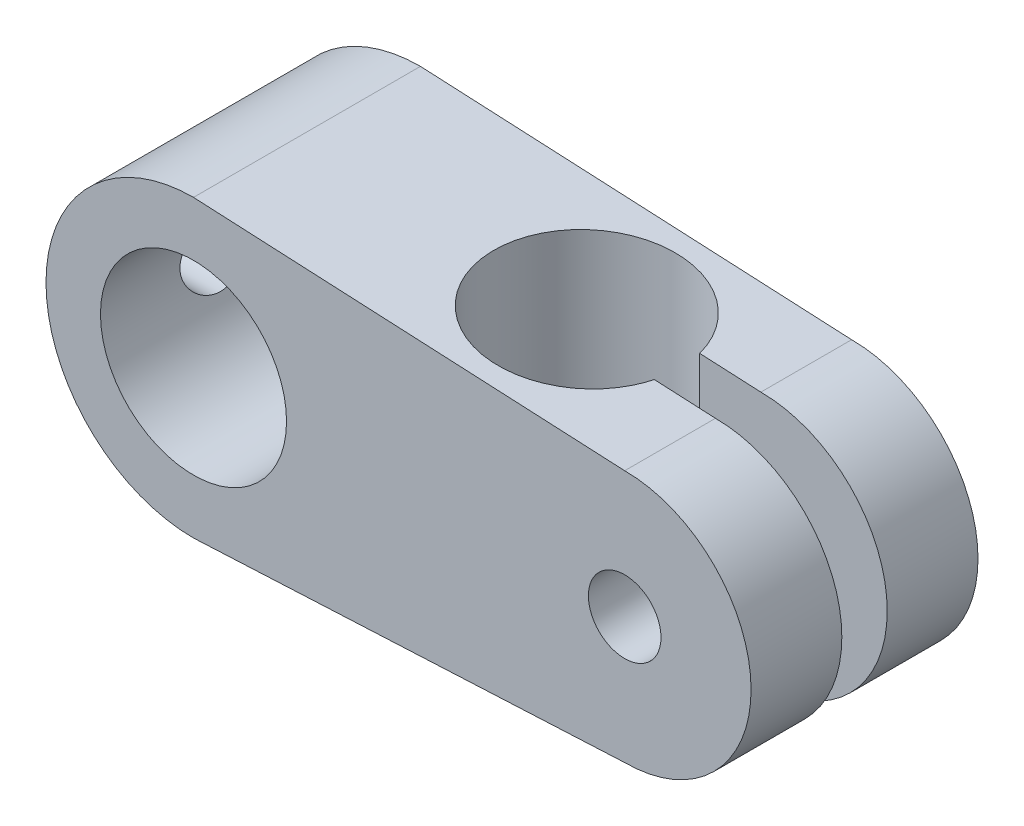
ISO-10303-21;
HEADER;
FILE_DESCRIPTION(('STEP AP214'),'2;1');
FILE_NAME('part.step','',(''),(''),'','','');
FILE_SCHEMA(('AUTOMOTIVE_DESIGN { 1 0 10303 214 1 1 1 1 }'));
ENDSEC;
DATA;
#1=APPLICATION_CONTEXT('core data for automotive mechanical design processes');
#2=APPLICATION_PROTOCOL_DEFINITION('international standard','automotive_design',2000,#1);
#3=PRODUCT_CONTEXT('',#1,'mechanical');
#4=PRODUCT('Part','Part','',(#3));
#5=PRODUCT_RELATED_PRODUCT_CATEGORY('part','',(#4));
#6=PRODUCT_DEFINITION_FORMATION('','',#4);
#7=PRODUCT_DEFINITION_CONTEXT('part definition',#1,'design');
#8=PRODUCT_DEFINITION('design','',#6,#7);
#9=PRODUCT_DEFINITION_SHAPE('','',#8);
#10=(LENGTH_UNIT() NAMED_UNIT(*) SI_UNIT(.MILLI.,.METRE.));
#11=(NAMED_UNIT(*) PLANE_ANGLE_UNIT() SI_UNIT($,.RADIAN.));
#12=(NAMED_UNIT(*) SI_UNIT($,.STERADIAN.) SOLID_ANGLE_UNIT());
#13=UNCERTAINTY_MEASURE_WITH_UNIT(LENGTH_MEASURE(1.E-05),#10,'distance_accuracy_value','');
#14=(GEOMETRIC_REPRESENTATION_CONTEXT(3) GLOBAL_UNCERTAINTY_ASSIGNED_CONTEXT((#13)) GLOBAL_UNIT_ASSIGNED_CONTEXT((#10,
#11,#12)) REPRESENTATION_CONTEXT('',''));
#15=CARTESIAN_POINT('',(0.,0.,0.));
#16=DIRECTION('',(0.,0.,1.));
#17=DIRECTION('',(1.,0.,0.));
#18=AXIS2_PLACEMENT_3D('',#15,#16,#17);
#19=CARTESIAN_POINT('',(0.317790422584702,-6.48442564411573,10.));
#20=DIRECTION('',(-0.0489495122695475,0.998801254128454,0.));
#21=DIRECTION('',(-0.998801254128454,-0.0489495122695475,0.));
#22=AXIS2_PLACEMENT_3D('',#19,#20,#21);
#23=PLANE('',#22);
#24=DIRECTION('',(0.998801254128454,0.0489495122695475,0.));
#25=VECTOR('',#24,1.);
#26=CARTESIAN_POINT('',(0.317790422584702,-6.48442564411573,4.));
#27=LINE('',#26,#25);
#28=CARTESIAN_POINT('',(16.3061190339678,-5.70086546705592,4.));
#29=VERTEX_POINT('',#28);
#30=CARTESIAN_POINT('',(19.,-5.56884304632462,4.));
#31=VERTEX_POINT('',#30);
#32=EDGE_CURVE('E133',#29,#31,#27,.T.);
#33=ORIENTED_EDGE('',*,*,#32,.F.);
#34=CARTESIAN_POINT('',(12.3299399635536,-5.89573108760722,5.));
#35=DIRECTION('',(-0.0489495122695475,0.998801254128454,0.));
#36=DIRECTION('',(0.998801254128454,0.0489495122695475,0.));
#37=AXIS2_PLACEMENT_3D('',#34,#35,#36);
#38=ELLIPSE('',#37,4.10492075681025,4.1);
#39=CARTESIAN_POINT('',(16.3061190339678,-5.70086546705592,6.));
#40=VERTEX_POINT('',#39);
#41=EDGE_CURVE('E132',#29,#40,#38,.T.);
#42=ORIENTED_EDGE('',*,*,#41,.T.);
#43=DIRECTION('',(0.998801254128454,0.0489495122695475,0.));
#44=VECTOR('',#43,1.);
#45=CARTESIAN_POINT('',(0.317790422584702,-6.48442564411573,6.));
#46=LINE('',#45,#44);
#47=CARTESIAN_POINT('',(19.,-5.56884304632462,6.));
#48=VERTEX_POINT('',#47);
#49=EDGE_CURVE('E64',#40,#48,#46,.T.);
#50=ORIENTED_EDGE('',*,*,#49,.T.);
#51=DIRECTION('',(0.,0.,-1.));
#52=VECTOR('',#51,1.);
#53=CARTESIAN_POINT('',(19.,-5.56884304632462,10.));
#54=LINE('',#53,#52);
#55=CARTESIAN_POINT('',(19.,-5.56884304632462,10.));
#56=VERTEX_POINT('',#55);
#57=EDGE_CURVE('E118',#56,#48,#54,.T.);
#58=ORIENTED_EDGE('',*,*,#57,.F.);
#59=DIRECTION('',(0.998801254128455,0.0489495122695475,0.));
#60=VECTOR('',#59,1.);
#61=CARTESIAN_POINT('',(0.317790422584702,-6.48442564411573,10.));
#62=LINE('',#61,#60);
#63=CARTESIAN_POINT('',(0.,-6.5,10.));
#64=VERTEX_POINT('',#63);
#65=EDGE_CURVE('E217',#64,#56,#62,.T.);
#66=ORIENTED_EDGE('',*,*,#65,.F.);
#67=DIRECTION('',(0.,0.,-1.));
#68=VECTOR('',#67,1.);
#69=CARTESIAN_POINT('',(0.,-6.5,10.));
#70=LINE('',#69,#68);
#71=CARTESIAN_POINT('',(0.,-6.5,0.));
#72=VERTEX_POINT('',#71);
#73=EDGE_CURVE('E227',#64,#72,#70,.T.);
#74=ORIENTED_EDGE('',*,*,#73,.T.);
#75=DIRECTION('',(0.998801254128455,0.0489495122695475,0.));
#76=VECTOR('',#75,1.);
#77=CARTESIAN_POINT('',(0.317790422584702,-6.48442564411573,0.));
#78=LINE('',#77,#76);
#79=CARTESIAN_POINT('',(19.,-5.56884304632462,0.));
#80=VERTEX_POINT('',#79);
#81=EDGE_CURVE('E230',#72,#80,#78,.T.);
#82=ORIENTED_EDGE('',*,*,#81,.T.);
#83=EDGE_CURVE('E204',#31,#80,#54,.T.);
#84=ORIENTED_EDGE('',*,*,#83,.F.);
#85=EDGE_LOOP('',(#33,#42,#50,#58,#66,#74,#82,#84));
#86=FACE_BOUND('',#85,.T.);
#87=ADVANCED_FACE('F41',(#86),#23,.F.);
#88=CARTESIAN_POINT('',(19.,0.,10.));
#89=DIRECTION('',(0.,0.,-1.));
#90=DIRECTION('',(-1.,0.,0.));
#91=AXIS2_PLACEMENT_3D('',#88,#89,#90);
#92=CYLINDRICAL_SURFACE('',#91,5.56884304632462);
#93=CARTESIAN_POINT('',(19.,0.,4.));
#94=DIRECTION('',(0.,0.,1.));
#95=DIRECTION('',(1.,0.,0.));
#96=AXIS2_PLACEMENT_3D('',#93,#94,#95);
#97=CIRCLE('',#96,5.56884304632462);
#98=CARTESIAN_POINT('',(19.,5.56884304632462,4.));
#99=VERTEX_POINT('',#98);
#100=EDGE_CURVE('E137',#31,#99,#97,.T.);
#101=ORIENTED_EDGE('',*,*,#100,.F.);
#102=ORIENTED_EDGE('',*,*,#83,.T.);
#103=CARTESIAN_POINT('',(19.,0.,0.));
#104=DIRECTION('',(0.,0.,1.));
#105=DIRECTION('',(1.,0.,0.));
#106=AXIS2_PLACEMENT_3D('',#103,#104,#105);
#107=CIRCLE('',#106,5.56884304632462);
#108=CARTESIAN_POINT('',(19.,5.56884304632462,0.));
#109=VERTEX_POINT('',#108);
#110=EDGE_CURVE('E232',#80,#109,#107,.T.);
#111=ORIENTED_EDGE('',*,*,#110,.T.);
#112=DIRECTION('',(0.,0.,-1.));
#113=VECTOR('',#112,1.);
#114=CARTESIAN_POINT('',(19.,5.56884304632462,10.));
#115=LINE('',#114,#113);
#116=EDGE_CURVE('E209',#99,#109,#115,.T.);
#117=ORIENTED_EDGE('',*,*,#116,.F.);
#118=EDGE_LOOP('',(#101,#102,#111,#117));
#119=FACE_BOUND('',#118,.T.);
#120=ADVANCED_FACE('F192',(#119),#92,.T.);
#121=CARTESIAN_POINT('',(0.317790422584702,6.48442564411573,10.));
#122=DIRECTION('',(0.0489495122695475,0.998801254128454,0.));
#123=DIRECTION('',(-0.998801254128454,0.0489495122695475,0.));
#124=AXIS2_PLACEMENT_3D('',#121,#122,#123);
#125=PLANE('',#124);
#126=CARTESIAN_POINT('',(12.3299399635536,5.89573108760721,5.));
#127=DIRECTION('',(0.0489495122695475,0.998801254128454,0.));
#128=DIRECTION('',(-0.998801254128454,0.0489495122695475,0.));
#129=AXIS2_PLACEMENT_3D('',#126,#127,#128);
#130=ELLIPSE('',#129,4.10492075681025,4.1);
#131=CARTESIAN_POINT('',(16.3061190339678,5.70086546705591,4.));
#132=VERTEX_POINT('',#131);
#133=CARTESIAN_POINT('',(16.3061190339678,5.70086546705591,6.));
#134=VERTEX_POINT('',#133);
#135=EDGE_CURVE('E124',#132,#134,#130,.T.);
#136=ORIENTED_EDGE('',*,*,#135,.F.);
#137=DIRECTION('',(0.998801254128454,-0.0489495122695475,0.));
#138=VECTOR('',#137,1.);
#139=CARTESIAN_POINT('',(0.317790422584702,6.48442564411573,4.));
#140=LINE('',#139,#138);
#141=EDGE_CURVE('E71',#132,#99,#140,.T.);
#142=ORIENTED_EDGE('',*,*,#141,.T.);
#143=ORIENTED_EDGE('',*,*,#116,.T.);
#144=DIRECTION('',(0.998801254128455,-0.0489495122695475,0.));
#145=VECTOR('',#144,1.);
#146=CARTESIAN_POINT('',(0.317790422584702,6.48442564411573,0.));
#147=LINE('',#146,#145);
#148=CARTESIAN_POINT('',(0.,6.5,0.));
#149=VERTEX_POINT('',#148);
#150=EDGE_CURVE('E234',#149,#109,#147,.T.);
#151=ORIENTED_EDGE('',*,*,#150,.F.);
#152=DIRECTION('',(0.,0.,-1.));
#153=VECTOR('',#152,1.);
#154=CARTESIAN_POINT('',(0.,6.5,10.));
#155=LINE('',#154,#153);
#156=CARTESIAN_POINT('',(0.,6.5,10.));
#157=VERTEX_POINT('',#156);
#158=EDGE_CURVE('E240',#157,#149,#155,.T.);
#159=ORIENTED_EDGE('',*,*,#158,.F.);
#160=DIRECTION('',(0.998801254128455,-0.0489495122695475,0.));
#161=VECTOR('',#160,1.);
#162=CARTESIAN_POINT('',(0.317790422584702,6.48442564411573,10.));
#163=LINE('',#162,#161);
#164=CARTESIAN_POINT('',(19.,5.56884304632462,10.));
#165=VERTEX_POINT('',#164);
#166=EDGE_CURVE('E223',#157,#165,#163,.T.);
#167=ORIENTED_EDGE('',*,*,#166,.T.);
#168=CARTESIAN_POINT('',(19.,5.56884304632462,6.));
#169=VERTEX_POINT('',#168);
#170=EDGE_CURVE('E127',#165,#169,#115,.T.);
#171=ORIENTED_EDGE('',*,*,#170,.T.);
#172=DIRECTION('',(0.998801254128454,-0.0489495122695475,0.));
#173=VECTOR('',#172,1.);
#174=CARTESIAN_POINT('',(0.317790422584702,6.48442564411573,6.));
#175=LINE('',#174,#173);
#176=EDGE_CURVE('E112',#134,#169,#175,.T.);
#177=ORIENTED_EDGE('',*,*,#176,.F.);
#178=EDGE_LOOP('',(#136,#142,#143,#151,#159,#167,#171,#177));
#179=FACE_BOUND('',#178,.T.);
#180=ADVANCED_FACE('F123',(#179),#125,.T.);
#181=CARTESIAN_POINT('',(12.3299399635536,-9.5,5.));
#182=DIRECTION('',(0.,1.,0.));
#183=DIRECTION('',(0.,0.,1.));
#184=AXIS2_PLACEMENT_3D('',#181,#182,#183);
#185=CYLINDRICAL_SURFACE('',#184,4.1);
#186=DIRECTION('',(0.,1.,0.));
#187=VECTOR('',#186,1.);
#188=CARTESIAN_POINT('',(16.3061190339678,-9.5,4.));
#189=LINE('',#188,#187);
#190=EDGE_CURVE('E11',#132,#29,#189,.F.);
#191=ORIENTED_EDGE('',*,*,#190,.F.);
#192=ORIENTED_EDGE('',*,*,#135,.T.);
#193=DIRECTION('',(0.,1.,0.));
#194=VECTOR('',#193,1.);
#195=CARTESIAN_POINT('',(16.3061190339678,-9.5,6.));
#196=LINE('',#195,#194);
#197=EDGE_CURVE('E56',#134,#40,#196,.F.);
#198=ORIENTED_EDGE('',*,*,#197,.T.);
#199=ORIENTED_EDGE('',*,*,#41,.F.);
#200=EDGE_LOOP('',(#191,#192,#198,#199));
#201=FACE_BOUND('',#200,.T.);
#202=ADVANCED_FACE('F131',(#201),#185,.F.);
#203=ORIENTED_EDGE('',*,*,#57,.T.);
#204=CARTESIAN_POINT('',(19.,0.,6.));
#205=DIRECTION('',(0.,0.,1.));
#206=DIRECTION('',(1.,0.,0.));
#207=AXIS2_PLACEMENT_3D('',#204,#205,#206);
#208=CIRCLE('',#207,5.56884304632462);
#209=EDGE_CURVE('E128',#48,#169,#208,.T.);
#210=ORIENTED_EDGE('',*,*,#209,.T.);
#211=ORIENTED_EDGE('',*,*,#170,.F.);
#212=CARTESIAN_POINT('',(19.,0.,10.));
#213=DIRECTION('',(0.,0.,1.));
#214=DIRECTION('',(1.,0.,0.));
#215=AXIS2_PLACEMENT_3D('',#212,#213,#214);
#216=CIRCLE('',#215,5.56884304632462);
#217=EDGE_CURVE('E221',#56,#165,#216,.T.);
#218=ORIENTED_EDGE('',*,*,#217,.F.);
#219=EDGE_LOOP('',(#203,#210,#211,#218));
#220=FACE_BOUND('',#219,.T.);
#221=ADVANCED_FACE('F178',(#220),#92,.T.);
#222=CARTESIAN_POINT('',(0.,0.,10.));
#223=DIRECTION('',(0.,0.,-1.));
#224=DIRECTION('',(-1.,0.,0.));
#225=AXIS2_PLACEMENT_3D('',#222,#223,#224);
#226=CYLINDRICAL_SURFACE('',#225,4.1);
#227=CARTESIAN_POINT('',(-4.1,0.,6.5));
#228=CARTESIAN_POINT('',(-4.10000165923337,-0.0813740986922771,6.50000225760716));
#229=CARTESIAN_POINT('',(-4.09755603188339,-0.162732381393539,6.49335733828631));
#230=CARTESIAN_POINT('',(-4.0880434904737,-0.323025233172477,6.46705471752055));
#231=CARTESIAN_POINT('',(-4.08097699235862,-0.401960019730074,6.44739818730522));
#232=CARTESIAN_POINT('',(-4.0629833885131,-0.555071487889497,6.39585535434763));
#233=CARTESIAN_POINT('',(-4.05206351053414,-0.629256772409257,6.36399193843785));
#234=CARTESIAN_POINT('',(-4.02745683042766,-0.771225667429234,6.28905328125515));
#235=CARTESIAN_POINT('',(-4.01376932587196,-0.839007646339359,6.24597519288033));
#236=CARTESIAN_POINT('',(-3.9844238013988,-0.96900582909011,6.14799554564769));
#237=CARTESIAN_POINT('',(-3.96871189278822,-1.03092640488845,6.09271802998933));
#238=CARTESIAN_POINT('',(-3.93736046691879,-1.14485387979851,5.97270690311466));
#239=CARTESIAN_POINT('',(-3.9217209715302,-1.196857953068,5.9079706057445));
#240=CARTESIAN_POINT('',(-3.89166611039283,-1.29131121165982,5.76804336393156));
#241=CARTESIAN_POINT('',(-3.87731482612409,-1.33335047267299,5.69256058268586));
#242=CARTESIAN_POINT('',(-3.85229543692908,-1.40400686283184,5.53498771496107));
#243=CARTESIAN_POINT('',(-3.84162594183641,-1.43262905944607,5.45290013678359));
#244=CARTESIAN_POINT('',(-3.82575230014126,-1.47448484912168,5.28784309714416));
#245=CARTESIAN_POINT('',(-3.82034931558201,-1.48828050899189,5.20503591647451));
#246=CARTESIAN_POINT('',(-3.81503701544761,-1.50184918247519,5.03811924551099));
#247=CARTESIAN_POINT('',(-3.8151255691561,-1.50162763476285,4.95401027297593));
#248=CARTESIAN_POINT('',(-3.82061424907924,-1.48759945441916,4.79193635812895));
#249=CARTESIAN_POINT('',(-3.8257138626067,-1.47456140896715,4.71389285468416));
#250=CARTESIAN_POINT('',(-3.84015239752295,-1.43653709451533,4.56118956125273));
#251=CARTESIAN_POINT('',(-3.84949192625715,-1.41154911372317,4.48653025772051));
#252=CARTESIAN_POINT('',(-3.87154626954869,-1.34989422199145,4.34110766092397));
#253=CARTESIAN_POINT('',(-3.88431981714444,-1.31302162475225,4.27044087065887));
#254=CARTESIAN_POINT('',(-3.91178223049179,-1.22878734925743,4.13607014520467));
#255=CARTESIAN_POINT('',(-3.92647173384818,-1.18142217552962,4.07236854096866));
#256=CARTESIAN_POINT('',(-3.95725340619187,-1.07399109681739,3.94946662025198));
#257=CARTESIAN_POINT('',(-3.97337530864785,-1.01330819384257,3.89081180984511));
#258=CARTESIAN_POINT('',(-4.00439734819749,-0.882778152896212,3.7843534506831));
#259=CARTESIAN_POINT('',(-4.01929731499878,-0.812929741108656,3.73655141276452));
#260=CARTESIAN_POINT('',(-4.04646797369406,-0.664714054152152,3.65259238243993));
#261=CARTESIAN_POINT('',(-4.05869867852746,-0.586240652637122,3.61660888427101));
#262=CARTESIAN_POINT('',(-4.07885780692981,-0.423796207871716,3.55853261541414));
#263=CARTESIAN_POINT('',(-4.08678804528155,-0.339827500413559,3.53643398473199));
#264=CARTESIAN_POINT('',(-4.09713788657497,-0.173373324809644,3.50778451852227));
#265=CARTESIAN_POINT('',(-4.09981778885173,-0.0910304386273682,3.50049855343126));
#266=CARTESIAN_POINT('',(-4.10016397145853,0.0737349888057336,3.49955130218482));
#267=CARTESIAN_POINT('',(-4.09783130035231,0.156157509792853,3.50588716652388));
#268=CARTESIAN_POINT('',(-4.08858637067619,0.315619682076168,3.5314392411991));
#269=CARTESIAN_POINT('',(-4.08184296018592,0.392746182232297,3.55018085162096));
#270=CARTESIAN_POINT('',(-4.06462370646838,0.542711380140934,3.59939476774775));
#271=CARTESIAN_POINT('',(-4.05414737765672,0.615549518619011,3.6298685996416));
#272=CARTESIAN_POINT('',(-4.03012814449962,0.757219099885719,3.70263978551782));
#273=CARTESIAN_POINT('',(-4.01650558442052,0.825874642238021,3.74525249453868));
#274=CARTESIAN_POINT('',(-3.98771009471685,0.955285476107552,3.8407324607531));
#275=CARTESIAN_POINT('',(-3.97253661391466,1.01603794141656,3.8936033696191));
#276=CARTESIAN_POINT('',(-3.94127640449602,1.13141965879987,4.01153499626531));
#277=CARTESIAN_POINT('',(-3.92518547050206,1.18552627116467,4.07710725549713));
#278=CARTESIAN_POINT('',(-3.8947254276213,1.28206233851266,4.21672556239296));
#279=CARTESIAN_POINT('',(-3.88035643514349,1.32449100427889,4.29077218229119));
#280=CARTESIAN_POINT('',(-3.85505006352086,1.39644382600854,4.44569559634257));
#281=CARTESIAN_POINT('',(-3.84412129484959,1.42593567403877,4.52658889549248));
#282=CARTESIAN_POINT('',(-3.82722201049798,1.47069890392734,4.69270108637262));
#283=CARTESIAN_POINT('',(-3.8212486271643,1.48597851095032,4.77791744602937));
#284=CARTESIAN_POINT('',(-3.81530529129036,1.50116808969002,4.94462468945327));
#285=CARTESIAN_POINT('',(-3.81498941101176,1.50196373488399,5.02602326416062));
#286=CARTESIAN_POINT('',(-3.819517104986,1.4904116187976,5.18772832749472));
#287=CARTESIAN_POINT('',(-3.82436023711105,1.47806498381182,5.26803490910807));
#288=CARTESIAN_POINT('',(-3.83837884223993,1.44125524124318,5.42303247375526));
#289=CARTESIAN_POINT('',(-3.84743089438031,1.41713639573516,5.49781731374052));
#290=CARTESIAN_POINT('',(-3.86878113434589,1.35776394991054,5.64232656909408));
#291=CARTESIAN_POINT('',(-3.88108012305306,1.32250760202065,5.71204973054306));
#292=CARTESIAN_POINT('',(-3.90831232622282,1.23979005983385,5.8482855368968));
#293=CARTESIAN_POINT('',(-3.92334727183663,1.19180200941116,5.91445773618905));
#294=CARTESIAN_POINT('',(-3.95399099920457,1.08581555321808,6.03809398930623));
#295=CARTESIAN_POINT('',(-3.96959995760681,1.02781404524661,6.09555533408883));
#296=CARTESIAN_POINT('',(-4.00057969291034,0.89994268034983,6.20309003506571));
#297=CARTESIAN_POINT('',(-4.01589864619417,0.829621427559436,6.25264383914761));
#298=CARTESIAN_POINT('',(-4.04373358074725,0.681116261966704,6.3392033078721));
#299=CARTESIAN_POINT('',(-4.05624957017589,0.602932372053398,6.37620900904226));
#300=CARTESIAN_POINT('',(-4.0772884441959,0.438970884453415,6.43705267749104));
#301=CARTESIAN_POINT('',(-4.08571283393727,0.353059962353392,6.46056810516217));
#302=CARTESIAN_POINT('',(-4.0970664915302,0.178092111155029,6.49203709735275));
#303=CARTESIAN_POINT('',(-4.09999818452701,0.0890365881704468,6.49999752980811));
#304=CARTESIAN_POINT('',(-4.1,0.,6.5));
#305=B_SPLINE_CURVE_WITH_KNOTS('',3,(#227,#228,#229,#230,#231,#232,#233,#234,#235,#236,#237,
#238,#239,#240,#241,#242,#243,#244,#245,#246,#247,#248,#249,#250,#251,#252,#253,#254,#255,#256,
#257,#258,#259,#260,#261,#262,#263,#264,#265,#266,#267,#268,#269,#270,#271,#272,#273,#274,#275,
#276,#277,#278,#279,#280,#281,#282,#283,#284,#285,#286,#287,#288,#289,#290,#291,#292,#293,#294,
#295,#296,#297,#298,#299,#300,#301,#302,#303,#304),.UNSPECIFIED.,.T.,.F.,(4,2,2,2,2,2,2,2,2,2,2,
2,2,2,2,2,2,2,2,2,2,2,2,2,2,2,2,2,2,2,2,2,2,2,2,2,2,2,4),(0.,0.243794049083335,
0.487566156226918,0.730883431502574,0.974262538792078,1.22657525763996,1.47895976933049,
1.74040261461266,2.00174663626736,2.25278996657886,2.50373589271099,2.74049742501652,
2.97729288286408,3.21842895973516,3.45964548923985,3.71623310666607,3.97285642230447,
4.23309408884832,4.49322185031935,4.74008954228772,4.9869055978436,5.22478638264146,
5.46269812268128,5.70746441042718,5.95231798947644,6.21067838421003,6.46905623512597,
6.72807572592058,6.98694521883869,7.22992815591335,7.47289027100512,7.70913823600102,
7.94544452791356,8.19369587790558,8.44202427542416,8.7028917113523,8.96375838788768,
9.23062685247367,9.49737746102694),.UNSPECIFIED.);
#306=CARTESIAN_POINT('',(-4.1,0.,6.5));
#307=VERTEX_POINT('',#306);
#308=EDGE_CURVE('E144',#307,#307,#305,.T.);
#309=ORIENTED_EDGE('',*,*,#308,.F.);
#310=EDGE_LOOP('',(#309));
#311=FACE_BOUND('',#310,.T.);
#312=CARTESIAN_POINT('',(0.,0.,10.));
#313=DIRECTION('',(0.,0.,1.));
#314=DIRECTION('',(1.,0.,0.));
#315=AXIS2_PLACEMENT_3D('',#312,#313,#314);
#316=CIRCLE('',#315,4.1);
#317=CARTESIAN_POINT('',(4.1,0.,10.));
#318=VERTEX_POINT('',#317);
#319=EDGE_CURVE('E214',#318,#318,#316,.T.);
#320=ORIENTED_EDGE('',*,*,#319,.T.);
#321=EDGE_LOOP('',(#320));
#322=FACE_BOUND('',#321,.T.);
#323=CARTESIAN_POINT('',(0.,0.,0.));
#324=DIRECTION('',(0.,0.,1.));
#325=DIRECTION('',(1.,0.,0.));
#326=AXIS2_PLACEMENT_3D('',#323,#324,#325);
#327=CIRCLE('',#326,4.1);
#328=CARTESIAN_POINT('',(4.1,0.,0.));
#329=VERTEX_POINT('',#328);
#330=EDGE_CURVE('E135',#329,#329,#327,.T.);
#331=ORIENTED_EDGE('',*,*,#330,.F.);
#332=EDGE_LOOP('',(#331));
#333=FACE_BOUND('',#332,.T.);
#334=ADVANCED_FACE('F43',(#311,#322,#333),#226,.F.);
#335=CARTESIAN_POINT('',(0.,0.,10.));
#336=DIRECTION('',(0.,0.,-1.));
#337=DIRECTION('',(-1.,0.,0.));
#338=AXIS2_PLACEMENT_3D('',#335,#336,#337);
#339=CYLINDRICAL_SURFACE('',#338,6.5);
#340=CARTESIAN_POINT('',(-6.5,0.,3.5));
#341=CARTESIAN_POINT('',(-6.49999849532867,0.0830761724763344,3.50000266535589));
#342=CARTESIAN_POINT('',(-6.49839124214547,0.166183602986827,3.50692492681109));
#343=CARTESIAN_POINT('',(-6.49213500375529,0.330029933246627,3.53439764288565));
#344=CARTESIAN_POINT('',(-6.48748401185166,0.410767233683362,3.5549570884414));
#345=CARTESIAN_POINT('',(-6.47565710646771,0.567482400649439,3.60901969894093));
#346=CARTESIAN_POINT('',(-6.46848397910972,0.643465410431957,3.64250858513135));
#347=CARTESIAN_POINT('',(-6.45238316831829,0.788732955280501,3.72143226506836));
#348=CARTESIAN_POINT('',(-6.44345549077589,0.858017512835939,3.76686701870594));
#349=CARTESIAN_POINT('',(-6.42464323305021,0.989152353123209,3.86924525167724));
#350=CARTESIAN_POINT('',(-6.41474568654138,1.05086679216121,3.92636036170251));
#351=CARTESIAN_POINT('',(-6.39519859507266,1.16393060397695,4.05010992657133));
#352=CARTESIAN_POINT('',(-6.38554907436474,1.2152789664991,4.11674530816047));
#353=CARTESIAN_POINT('',(-6.36746174180576,1.3067669575256,4.25866692756034));
#354=CARTESIAN_POINT('',(-6.35904049089481,1.34675925477788,4.33405044097683));
#355=CARTESIAN_POINT('',(-6.34455046029963,1.41345395330062,4.49069509865057));
#356=CARTESIAN_POINT('',(-6.33848136485541,1.44015813854148,4.5719554522451));
#357=CARTESIAN_POINT('',(-6.32951534623235,1.4790642425856,4.73656580158269));
#358=CARTESIAN_POINT('',(-6.32656557105072,1.49150809496879,4.8198556733748));
#359=CARTESIAN_POINT('',(-6.32401364937952,1.50229307046533,4.98738908704564));
#360=CARTESIAN_POINT('',(-6.32441104286173,1.50063613156308,5.07163249628275));
#361=CARTESIAN_POINT('',(-6.32846083321139,1.48346063285703,5.2368628078238));
#362=CARTESIAN_POINT('',(-6.33204661249556,1.46822575315178,5.31788108134394));
#363=CARTESIAN_POINT('',(-6.34196351386388,1.42477741479348,5.47617979190162));
#364=CARTESIAN_POINT('',(-6.34829480548987,1.39656315462671,5.55345999777708));
#365=CARTESIAN_POINT('',(-6.36305332227188,1.32770349075046,5.70287267164093));
#366=CARTESIAN_POINT('',(-6.37149843240945,1.28695129246528,5.77495408091097));
#367=CARTESIAN_POINT('',(-6.38952239681953,1.19424748975256,5.91135923628938));
#368=CARTESIAN_POINT('',(-6.39910142196225,1.1422941964553,5.97568181025902));
#369=CARTESIAN_POINT('',(-6.41859777640793,1.02717321086453,6.09637395005097));
#370=CARTESIAN_POINT('',(-6.42851768847713,0.963764950845053,6.15251388512496));
#371=CARTESIAN_POINT('',(-6.44736816069401,0.828318641053405,6.25340307097536));
#372=CARTESIAN_POINT('',(-6.45629869876005,0.75628039874503,6.29815206754859));
#373=CARTESIAN_POINT('',(-6.47219854082994,0.605321277972371,6.37505591414332));
#374=CARTESIAN_POINT('',(-6.47916273202417,0.526383143294248,6.40717801569267));
#375=CARTESIAN_POINT('',(-6.49030757986402,0.364032396252582,6.45763614369505));
#376=CARTESIAN_POINT('',(-6.49448868821629,0.280620512374237,6.47597440738847));
#377=CARTESIAN_POINT('',(-6.49953102945198,0.11365732393164,6.49800415034815));
#378=CARTESIAN_POINT('',(-6.50046326526885,0.0301494450127287,6.50200893605973));
#379=CARTESIAN_POINT('',(-6.49910299913129,-0.136342371579224,6.49611098524072));
#380=CARTESIAN_POINT('',(-6.49681074208307,-0.219326348562745,6.486209304932));
#381=CARTESIAN_POINT('',(-6.48930412349636,-0.381357903798024,6.45303880339423));
#382=CARTESIAN_POINT('',(-6.48412623941868,-0.4604414648757,6.42993675868286));
#383=CARTESIAN_POINT('',(-6.47142910428788,-0.613609622481664,6.37120841107563));
#384=CARTESIAN_POINT('',(-6.4639096389422,-0.687693760726587,6.33558096186415));
#385=CARTESIAN_POINT('',(-6.44718996088191,-0.830037615110187,6.25217735607902));
#386=CARTESIAN_POINT('',(-6.43796535296184,-0.898188410296326,6.2042203081148));
#387=CARTESIAN_POINT('',(-6.41890391913982,-1.02558718048179,6.09775438264144));
#388=CARTESIAN_POINT('',(-6.40906700421673,-1.08483385664762,6.03924396845844));
#389=CARTESIAN_POINT('',(-6.38964047483402,-1.19400102833017,5.91188761412097));
#390=CARTESIAN_POINT('',(-6.38006017503739,-1.24370343589042,5.8428530353226));
#391=CARTESIAN_POINT('',(-6.36246188496285,-1.33081235446409,5.69723411978472));
#392=CARTESIAN_POINT('',(-6.35444382521927,-1.3682194122462,5.62065011896155));
#393=CARTESIAN_POINT('',(-6.34095951164845,-1.42941066868129,5.46252401157748));
#394=CARTESIAN_POINT('',(-6.33547846174878,-1.45327404481082,5.38101387031656));
#395=CARTESIAN_POINT('',(-6.3276660054956,-1.48692530676327,5.21499600715224));
#396=CARTESIAN_POINT('',(-6.32533402889437,-1.49671574099563,5.13048883080998));
#397=CARTESIAN_POINT('',(-6.32412253425542,-1.50182536015786,4.96308177294738));
#398=CARTESIAN_POINT('',(-6.32516029248235,-1.49749127871471,4.88019288935144));
#399=CARTESIAN_POINT('',(-6.33038270361014,-1.47525685980881,4.71636132133182));
#400=CARTESIAN_POINT('',(-6.33456731037362,-1.45735672124418,4.63541860839239));
#401=CARTESIAN_POINT('',(-6.34556939165105,-1.40867420720143,4.47809008920887));
#402=CARTESIAN_POINT('',(-6.35237543592818,-1.37794771033572,4.40168613929415));
#403=CARTESIAN_POINT('',(-6.36785683112449,-1.304530822271,4.25506819345867));
#404=CARTESIAN_POINT('',(-6.37653240158127,-1.26183902581514,4.18485492587265));
#405=CARTESIAN_POINT('',(-6.39501829374307,-1.16457679516263,4.05091447140992));
#406=CARTESIAN_POINT('',(-6.4048496868242,-1.10976162033287,3.98736788045042));
#407=CARTESIAN_POINT('',(-6.42440402438128,-0.990297714593211,3.87026175236171));
#408=CARTESIAN_POINT('',(-6.43412694306169,-0.92564669602438,3.81670454506972));
#409=CARTESIAN_POINT('',(-6.45253999299533,-0.787191932761554,3.72033273205119));
#410=CARTESIAN_POINT('',(-6.46121270567525,-0.713266869084887,3.67768888171022));
#411=CARTESIAN_POINT('',(-6.47637045552876,-0.559109641475369,3.60550085059139));
#412=CARTESIAN_POINT('',(-6.48285722936411,-0.478882547101935,3.57594626489707));
#413=CARTESIAN_POINT('',(-6.49182723396727,-0.332210374198768,3.53572152644427));
#414=CARTESIAN_POINT('',(-6.49487228966801,-0.266526367321009,3.522352728973));
#415=CARTESIAN_POINT('',(-6.4989592245111,-0.133901630280836,3.50449113338528));
#416=CARTESIAN_POINT('',(-6.5000012127936,-0.066960968789831,3.49999785167266));
#417=CARTESIAN_POINT('',(-6.5,0.,3.5));
#418=B_SPLINE_CURVE_WITH_KNOTS('',3,(#340,#341,#342,#343,#344,#345,#346,#347,#348,#349,#350,
#351,#352,#353,#354,#355,#356,#357,#358,#359,#360,#361,#362,#363,#364,#365,#366,#367,#368,#369,
#370,#371,#372,#373,#374,#375,#376,#377,#378,#379,#380,#381,#382,#383,#384,#385,#386,#387,#388,
#389,#390,#391,#392,#393,#394,#395,#396,#397,#398,#399,#400,#401,#402,#403,#404,#405,#406,#407,
#408,#409,#410,#411,#412,#413,#414,#415,#416,#417),.UNSPECIFIED.,.T.,.F.,(4,2,2,2,2,2,2,2,2,2,2,
2,2,2,2,2,2,2,2,2,2,2,2,2,2,2,2,2,2,2,2,2,2,2,2,2,2,2,4),(0.,0.248983311217114,
0.498130939431098,0.747004202472747,0.995876629917202,1.24870930222222,1.50156660317464,
1.75756840109411,2.0135358206962,2.26509316141456,2.51661592915602,2.76300377758328,
3.00940684320484,3.25796969712265,3.50657005489342,3.7611752627951,4.01578615203542,
4.27105309773002,4.52627860236006,4.77589001432916,5.02548246887371,5.27198911757478,
5.51851833225481,5.76889433751052,6.01930682944867,6.27489540554877,6.53047261420161,
6.7845398863154,7.03856114466417,7.28639401438666,7.53422325058917,7.7809838930653,
8.02777352833801,8.28009323709707,8.53247172133002,8.78858609727296,9.04449651578221,
9.24519271684376,9.44587798236134),.UNSPECIFIED.);
#419=CARTESIAN_POINT('',(-6.5,0.,3.5));
#420=VERTEX_POINT('',#419);
#421=EDGE_CURVE('E46',#420,#420,#418,.T.);
#422=ORIENTED_EDGE('',*,*,#421,.T.);
#423=EDGE_LOOP('',(#422));
#424=FACE_BOUND('',#423,.T.);
#425=CARTESIAN_POINT('',(0.,0.,0.));
#426=DIRECTION('',(0.,0.,1.));
#427=DIRECTION('',(1.,0.,0.));
#428=AXIS2_PLACEMENT_3D('',#425,#426,#427);
#429=CIRCLE('',#428,6.5);
#430=EDGE_CURVE('E218',#149,#72,#429,.T.);
#431=ORIENTED_EDGE('',*,*,#430,.T.);
#432=ORIENTED_EDGE('',*,*,#73,.F.);
#433=CARTESIAN_POINT('',(0.,0.,10.));
#434=DIRECTION('',(0.,0.,1.));
#435=DIRECTION('',(1.,0.,0.));
#436=AXIS2_PLACEMENT_3D('',#433,#434,#435);
#437=CIRCLE('',#436,6.5);
#438=EDGE_CURVE('E225',#157,#64,#437,.T.);
#439=ORIENTED_EDGE('',*,*,#438,.F.);
#440=ORIENTED_EDGE('',*,*,#158,.T.);
#441=EDGE_LOOP('',(#431,#432,#439,#440));
#442=FACE_BOUND('',#441,.T.);
#443=ADVANCED_FACE('F182',(#424,#442),#339,.T.);
#444=CARTESIAN_POINT('',(0.,0.,10.));
#445=DIRECTION('',(0.,0.,1.));
#446=DIRECTION('',(1.,0.,0.));
#447=AXIS2_PLACEMENT_3D('',#444,#445,#446);
#448=PLANE('',#447);
#449=CARTESIAN_POINT('',(19.,0.,10.));
#450=DIRECTION('',(0.,0.,1.));
#451=DIRECTION('',(1.,0.,0.));
#452=AXIS2_PLACEMENT_3D('',#449,#450,#451);
#453=CIRCLE('',#452,1.6);
#454=CARTESIAN_POINT('',(20.6,0.,10.));
#455=VERTEX_POINT('',#454);
#456=EDGE_CURVE('E129',#455,#455,#453,.T.);
#457=ORIENTED_EDGE('',*,*,#456,.F.);
#458=EDGE_LOOP('',(#457));
#459=FACE_BOUND('',#458,.T.);
#460=ORIENTED_EDGE('',*,*,#319,.F.);
#461=EDGE_LOOP('',(#460));
#462=FACE_BOUND('',#461,.T.);
#463=ORIENTED_EDGE('',*,*,#65,.T.);
#464=ORIENTED_EDGE('',*,*,#217,.T.);
#465=ORIENTED_EDGE('',*,*,#166,.F.);
#466=ORIENTED_EDGE('',*,*,#438,.T.);
#467=EDGE_LOOP('',(#463,#464,#465,#466));
#468=FACE_BOUND('',#467,.T.);
#469=ADVANCED_FACE('F179',(#459,#462,#468),#448,.T.);
#470=CARTESIAN_POINT('',(0.,0.,0.));
#471=DIRECTION('',(0.,0.,1.));
#472=DIRECTION('',(1.,0.,0.));
#473=AXIS2_PLACEMENT_3D('',#470,#471,#472);
#474=PLANE('',#473);
#475=CARTESIAN_POINT('',(19.,0.,0.));
#476=DIRECTION('',(0.,0.,1.));
#477=DIRECTION('',(1.,0.,0.));
#478=AXIS2_PLACEMENT_3D('',#475,#476,#477);
#479=CIRCLE('',#478,1.6);
#480=CARTESIAN_POINT('',(20.6,0.,0.));
#481=VERTEX_POINT('',#480);
#482=EDGE_CURVE('E148',#481,#481,#479,.T.);
#483=ORIENTED_EDGE('',*,*,#482,.T.);
#484=EDGE_LOOP('',(#483));
#485=FACE_BOUND('',#484,.T.);
#486=ORIENTED_EDGE('',*,*,#330,.T.);
#487=EDGE_LOOP('',(#486));
#488=FACE_BOUND('',#487,.T.);
#489=ORIENTED_EDGE('',*,*,#81,.F.);
#490=ORIENTED_EDGE('',*,*,#430,.F.);
#491=ORIENTED_EDGE('',*,*,#150,.T.);
#492=ORIENTED_EDGE('',*,*,#110,.F.);
#493=EDGE_LOOP('',(#489,#490,#491,#492));
#494=FACE_BOUND('',#493,.T.);
#495=ADVANCED_FACE('F174',(#485,#488,#494),#474,.F.);
#496=CARTESIAN_POINT('',(0.,0.,6.));
#497=DIRECTION('',(0.,0.,1.));
#498=DIRECTION('',(1.,0.,0.));
#499=AXIS2_PLACEMENT_3D('',#496,#497,#498);
#500=PLANE('',#499);
#501=CARTESIAN_POINT('',(19.,0.,6.));
#502=DIRECTION('',(0.,0.,1.));
#503=DIRECTION('',(1.,0.,0.));
#504=AXIS2_PLACEMENT_3D('',#501,#502,#503);
#505=CIRCLE('',#504,1.6);
#506=CARTESIAN_POINT('',(20.6,0.,6.));
#507=VERTEX_POINT('',#506);
#508=EDGE_CURVE('E143',#507,#507,#505,.T.);
#509=ORIENTED_EDGE('',*,*,#508,.T.);
#510=EDGE_LOOP('',(#509));
#511=FACE_BOUND('',#510,.T.);
#512=ORIENTED_EDGE('',*,*,#197,.F.);
#513=ORIENTED_EDGE('',*,*,#176,.T.);
#514=ORIENTED_EDGE('',*,*,#209,.F.);
#515=ORIENTED_EDGE('',*,*,#49,.F.);
#516=EDGE_LOOP('',(#512,#513,#514,#515));
#517=FACE_BOUND('',#516,.T.);
#518=ADVANCED_FACE('F111',(#511,#517),#500,.F.);
#519=CARTESIAN_POINT('',(0.,0.,4.));
#520=DIRECTION('',(0.,0.,1.));
#521=DIRECTION('',(1.,0.,0.));
#522=AXIS2_PLACEMENT_3D('',#519,#520,#521);
#523=PLANE('',#522);
#524=CARTESIAN_POINT('',(19.,0.,4.));
#525=DIRECTION('',(0.,0.,1.));
#526=DIRECTION('',(1.,0.,0.));
#527=AXIS2_PLACEMENT_3D('',#524,#525,#526);
#528=CIRCLE('',#527,1.6);
#529=CARTESIAN_POINT('',(20.6,0.,4.));
#530=VERTEX_POINT('',#529);
#531=EDGE_CURVE('E141',#530,#530,#528,.T.);
#532=ORIENTED_EDGE('',*,*,#531,.F.);
#533=EDGE_LOOP('',(#532));
#534=FACE_BOUND('',#533,.T.);
#535=ORIENTED_EDGE('',*,*,#32,.T.);
#536=ORIENTED_EDGE('',*,*,#100,.T.);
#537=ORIENTED_EDGE('',*,*,#141,.F.);
#538=ORIENTED_EDGE('',*,*,#190,.T.);
#539=EDGE_LOOP('',(#535,#536,#537,#538));
#540=FACE_BOUND('',#539,.T.);
#541=ADVANCED_FACE('F168',(#534,#540),#523,.T.);
#542=CARTESIAN_POINT('',(19.,0.,-9.50000000000001));
#543=DIRECTION('',(0.,0.,1.));
#544=DIRECTION('',(1.,0.,0.));
#545=AXIS2_PLACEMENT_3D('',#542,#543,#544);
#546=CYLINDRICAL_SURFACE('',#545,1.6);
#547=ORIENTED_EDGE('',*,*,#531,.T.);
#548=EDGE_LOOP('',(#547));
#549=FACE_BOUND('',#548,.T.);
#550=ORIENTED_EDGE('',*,*,#482,.F.);
#551=EDGE_LOOP('',(#550));
#552=FACE_BOUND('',#551,.T.);
#553=ADVANCED_FACE('F164',(#549,#552),#546,.F.);
#554=ORIENTED_EDGE('',*,*,#456,.T.);
#555=EDGE_LOOP('',(#554));
#556=FACE_BOUND('',#555,.T.);
#557=ORIENTED_EDGE('',*,*,#508,.F.);
#558=EDGE_LOOP('',(#557));
#559=FACE_BOUND('',#558,.T.);
#560=ADVANCED_FACE('F163',(#556,#559),#546,.F.);
#561=CARTESIAN_POINT('',(-39.,0.,5.));
#562=DIRECTION('',(1.,0.,0.));
#563=DIRECTION('',(0.,0.,-1.));
#564=AXIS2_PLACEMENT_3D('',#561,#562,#563);
#565=CYLINDRICAL_SURFACE('',#564,1.5);
#566=ORIENTED_EDGE('',*,*,#308,.T.);
#567=EDGE_LOOP('',(#566));
#568=FACE_BOUND('',#567,.T.);
#569=ORIENTED_EDGE('',*,*,#421,.F.);
#570=EDGE_LOOP('',(#569));
#571=FACE_BOUND('',#570,.T.);
#572=ADVANCED_FACE('F159',(#568,#571),#565,.F.);
#573=CLOSED_SHELL('',(#87,#120,#180,#202,#221,#334,#443,#469,#495,#518,#541,#553,#560,#572));
#574=MANIFOLD_SOLID_BREP('B2',#573);
#575=ADVANCED_BREP_SHAPE_REPRESENTATION('',(#18,#574),#14);
#576=SHAPE_DEFINITION_REPRESENTATION(#9,#575);
ENDSEC;
END-ISO-10303-21;
